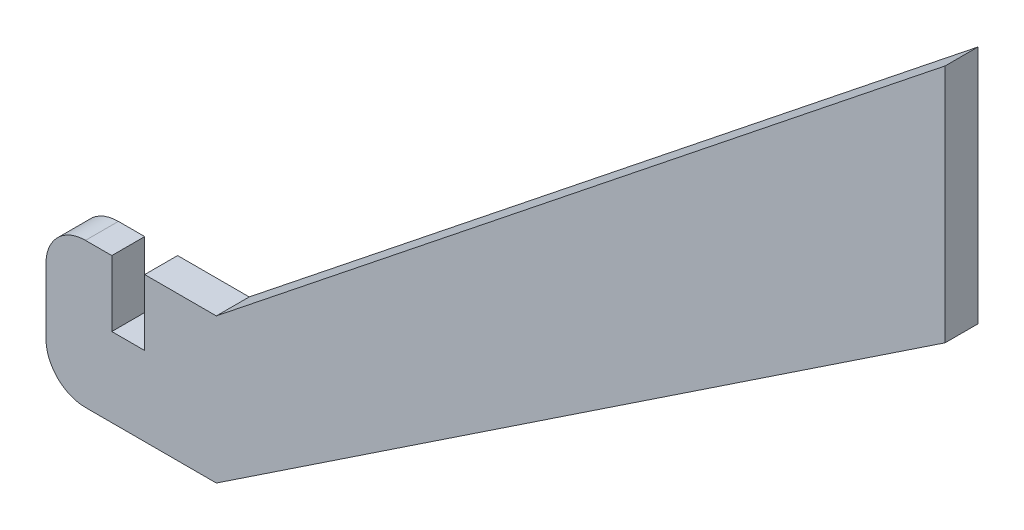
ISO-10303-21;
HEADER;
FILE_DESCRIPTION(('STEP AP214'),'2;1');
FILE_NAME('part.step','',(''),(''),'','','');
FILE_SCHEMA(('AUTOMOTIVE_DESIGN { 1 0 10303 214 1 1 1 1 }'));
ENDSEC;
DATA;
#1=APPLICATION_CONTEXT('core data for automotive mechanical design processes');
#2=APPLICATION_PROTOCOL_DEFINITION('international standard','automotive_design',2000,#1);
#3=PRODUCT_CONTEXT('',#1,'mechanical');
#4=PRODUCT('Part','Part','',(#3));
#5=PRODUCT_RELATED_PRODUCT_CATEGORY('part','',(#4));
#6=PRODUCT_DEFINITION_FORMATION('','',#4);
#7=PRODUCT_DEFINITION_CONTEXT('part definition',#1,'design');
#8=PRODUCT_DEFINITION('design','',#6,#7);
#9=PRODUCT_DEFINITION_SHAPE('','',#8);
#10=(LENGTH_UNIT() NAMED_UNIT(*) SI_UNIT(.MILLI.,.METRE.));
#11=(NAMED_UNIT(*) PLANE_ANGLE_UNIT() SI_UNIT($,.RADIAN.));
#12=(NAMED_UNIT(*) SI_UNIT($,.STERADIAN.) SOLID_ANGLE_UNIT());
#13=UNCERTAINTY_MEASURE_WITH_UNIT(LENGTH_MEASURE(1.E-05),#10,'distance_accuracy_value','');
#14=(GEOMETRIC_REPRESENTATION_CONTEXT(3) GLOBAL_UNCERTAINTY_ASSIGNED_CONTEXT((#13)) GLOBAL_UNIT_ASSIGNED_CONTEXT((#10,
#11,#12)) REPRESENTATION_CONTEXT('',''));
#15=CARTESIAN_POINT('',(0.,0.,0.));
#16=DIRECTION('',(0.,0.,1.));
#17=DIRECTION('',(1.,0.,0.));
#18=AXIS2_PLACEMENT_3D('',#15,#16,#17);
#19=CARTESIAN_POINT('',(1.29431293515836,0.,0.125));
#20=DIRECTION('',(0.,1.,0.));
#21=DIRECTION('',(-1.,0.,0.));
#22=AXIS2_PLACEMENT_3D('',#19,#20,#21);
#23=PLANE('',#22);
#24=DIRECTION('',(1.,0.,0.));
#25=VECTOR('',#24,1.);
#26=CARTESIAN_POINT('',(1.29431293515836,0.,0.125));
#27=LINE('',#26,#25);
#28=CARTESIAN_POINT('',(0.3,0.,0.125));
#29=VERTEX_POINT('',#28);
#30=CARTESIAN_POINT('',(1.29431293515836,0.,0.125));
#31=VERTEX_POINT('',#30);
#32=EDGE_CURVE('E129',#29,#31,#27,.T.);
#33=ORIENTED_EDGE('',*,*,#32,.F.);
#34=DIRECTION('',(0.,0.,-1.));
#35=VECTOR('',#34,1.);
#36=CARTESIAN_POINT('',(0.3,0.,0.125));
#37=LINE('',#36,#35);
#38=CARTESIAN_POINT('',(0.3,0.,-0.125));
#39=VERTEX_POINT('',#38);
#40=EDGE_CURVE('E11',#29,#39,#37,.T.);
#41=ORIENTED_EDGE('',*,*,#40,.T.);
#42=DIRECTION('',(1.,0.,0.));
#43=VECTOR('',#42,1.);
#44=CARTESIAN_POINT('',(1.29431293515836,0.,-0.125));
#45=LINE('',#44,#43);
#46=CARTESIAN_POINT('',(1.29431293515836,0.,-0.125));
#47=VERTEX_POINT('',#46);
#48=EDGE_CURVE('E151',#39,#47,#45,.T.);
#49=ORIENTED_EDGE('',*,*,#48,.T.);
#50=DIRECTION('',(0.,0.,-1.));
#51=VECTOR('',#50,1.);
#52=CARTESIAN_POINT('',(1.29431293515836,0.,0.125));
#53=LINE('',#52,#51);
#54=EDGE_CURVE('E143',#31,#47,#53,.T.);
#55=ORIENTED_EDGE('',*,*,#54,.F.);
#56=EDGE_LOOP('',(#33,#41,#49,#55));
#57=FACE_BOUND('',#56,.T.);
#58=ADVANCED_FACE('F39',(#57),#23,.F.);
#59=CARTESIAN_POINT('',(6.83221590449934,3.69176152899713,0.125));
#60=DIRECTION('',(-0.554682119391637,0.832062345276604,0.));
#61=DIRECTION('',(-0.832062345276604,-0.554682119391637,0.));
#62=AXIS2_PLACEMENT_3D('',#59,#60,#61);
#63=PLANE('',#62);
#64=DIRECTION('',(0.832062345276604,0.554682119391637,0.));
#65=VECTOR('',#64,1.);
#66=CARTESIAN_POINT('',(6.83221590449934,3.69176152899713,-0.125));
#67=LINE('',#66,#65);
#68=CARTESIAN_POINT('',(6.83221590449934,3.69176152899713,-0.125));
#69=VERTEX_POINT('',#68);
#70=EDGE_CURVE('E249',#47,#69,#67,.T.);
#71=ORIENTED_EDGE('',*,*,#70,.T.);
#72=DIRECTION('',(0.,0.,-1.));
#73=VECTOR('',#72,1.);
#74=CARTESIAN_POINT('',(6.83221590449934,3.69176152899713,0.125));
#75=LINE('',#74,#73);
#76=CARTESIAN_POINT('',(6.83221590449934,3.69176152899713,0.125));
#77=VERTEX_POINT('',#76);
#78=EDGE_CURVE('E145',#77,#69,#75,.T.);
#79=ORIENTED_EDGE('',*,*,#78,.F.);
#80=DIRECTION('',(0.832062345276604,0.554682119391637,0.));
#81=VECTOR('',#80,1.);
#82=CARTESIAN_POINT('',(6.83221590449934,3.69176152899713,0.125));
#83=LINE('',#82,#81);
#84=EDGE_CURVE('E132',#31,#77,#83,.T.);
#85=ORIENTED_EDGE('',*,*,#84,.F.);
#86=ORIENTED_EDGE('',*,*,#54,.T.);
#87=EDGE_LOOP('',(#71,#79,#85,#86));
#88=FACE_BOUND('',#87,.T.);
#89=ADVANCED_FACE('F142',(#88),#63,.F.);
#90=CARTESIAN_POINT('',(6.83221590449934,5.51399279259194,0.125));
#91=DIRECTION('',(-1.,0.,0.));
#92=DIRECTION('',(0.,0.,1.));
#93=AXIS2_PLACEMENT_3D('',#90,#91,#92);
#94=PLANE('',#93);
#95=DIRECTION('',(0.,1.,0.));
#96=VECTOR('',#95,1.);
#97=CARTESIAN_POINT('',(6.83221590449934,5.51399279259194,-0.125));
#98=LINE('',#97,#96);
#99=CARTESIAN_POINT('',(6.83221590449934,5.51399279259194,-0.125));
#100=VERTEX_POINT('',#99);
#101=EDGE_CURVE('E240',#69,#100,#98,.T.);
#102=ORIENTED_EDGE('',*,*,#101,.T.);
#103=DIRECTION('',(0.,0.,-1.));
#104=VECTOR('',#103,1.);
#105=CARTESIAN_POINT('',(6.83221590449934,5.51399279259194,0.125));
#106=LINE('',#105,#104);
#107=CARTESIAN_POINT('',(6.83221590449934,5.51399279259194,0.125));
#108=VERTEX_POINT('',#107);
#109=EDGE_CURVE('E160',#108,#100,#106,.T.);
#110=ORIENTED_EDGE('',*,*,#109,.F.);
#111=DIRECTION('',(0.,1.,0.));
#112=VECTOR('',#111,1.);
#113=CARTESIAN_POINT('',(6.83221590449934,5.51399279259194,0.125));
#114=LINE('',#113,#112);
#115=EDGE_CURVE('E148',#77,#108,#114,.T.);
#116=ORIENTED_EDGE('',*,*,#115,.F.);
#117=ORIENTED_EDGE('',*,*,#78,.T.);
#118=EDGE_LOOP('',(#102,#110,#116,#117));
#119=FACE_BOUND('',#118,.T.);
#120=ADVANCED_FACE('F277',(#119),#94,.F.);
#121=CARTESIAN_POINT('',(1.29431293515836,1.1,0.125));
#122=DIRECTION('',(0.623288024914606,-0.781992351623754,0.));
#123=DIRECTION('',(0.781992351623754,0.623288024914606,0.));
#124=AXIS2_PLACEMENT_3D('',#121,#122,#123);
#125=PLANE('',#124);
#126=DIRECTION('',(-0.781992351623754,-0.623288024914606,0.));
#127=VECTOR('',#126,1.);
#128=CARTESIAN_POINT('',(1.29431293515836,1.1,-0.125));
#129=LINE('',#128,#127);
#130=CARTESIAN_POINT('',(1.29431293515836,1.1,-0.125));
#131=VERTEX_POINT('',#130);
#132=EDGE_CURVE('E235',#100,#131,#129,.T.);
#133=ORIENTED_EDGE('',*,*,#132,.T.);
#134=DIRECTION('',(0.,0.,-1.));
#135=VECTOR('',#134,1.);
#136=CARTESIAN_POINT('',(1.29431293515836,1.1,0.125));
#137=LINE('',#136,#135);
#138=CARTESIAN_POINT('',(1.29431293515836,1.1,0.125));
#139=VERTEX_POINT('',#138);
#140=EDGE_CURVE('E224',#139,#131,#137,.T.);
#141=ORIENTED_EDGE('',*,*,#140,.F.);
#142=DIRECTION('',(-0.781992351623754,-0.623288024914606,0.));
#143=VECTOR('',#142,1.);
#144=CARTESIAN_POINT('',(1.29431293515836,1.1,0.125));
#145=LINE('',#144,#143);
#146=EDGE_CURVE('E236',#108,#139,#145,.T.);
#147=ORIENTED_EDGE('',*,*,#146,.F.);
#148=ORIENTED_EDGE('',*,*,#109,.T.);
#149=EDGE_LOOP('',(#133,#141,#147,#148));
#150=FACE_BOUND('',#149,.T.);
#151=ADVANCED_FACE('F233',(#150),#125,.F.);
#152=CARTESIAN_POINT('',(0.75,1.1,0.125));
#153=DIRECTION('',(0.,-1.,0.));
#154=DIRECTION('',(0.,0.,-1.));
#155=AXIS2_PLACEMENT_3D('',#152,#153,#154);
#156=PLANE('',#155);
#157=DIRECTION('',(-1.,0.,0.));
#158=VECTOR('',#157,1.);
#159=CARTESIAN_POINT('',(0.75,1.1,-0.125));
#160=LINE('',#159,#158);
#161=CARTESIAN_POINT('',(0.75,1.1,-0.125));
#162=VERTEX_POINT('',#161);
#163=EDGE_CURVE('E242',#131,#162,#160,.T.);
#164=ORIENTED_EDGE('',*,*,#163,.T.);
#165=DIRECTION('',(0.,0.,-1.));
#166=VECTOR('',#165,1.);
#167=CARTESIAN_POINT('',(0.75,1.1,0.125));
#168=LINE('',#167,#166);
#169=CARTESIAN_POINT('',(0.75,1.1,0.125));
#170=VERTEX_POINT('',#169);
#171=EDGE_CURVE('E220',#170,#162,#168,.T.);
#172=ORIENTED_EDGE('',*,*,#171,.F.);
#173=DIRECTION('',(-1.,0.,0.));
#174=VECTOR('',#173,1.);
#175=CARTESIAN_POINT('',(0.75,1.1,0.125));
#176=LINE('',#175,#174);
#177=EDGE_CURVE('E281',#139,#170,#176,.T.);
#178=ORIENTED_EDGE('',*,*,#177,.F.);
#179=ORIENTED_EDGE('',*,*,#140,.T.);
#180=EDGE_LOOP('',(#164,#172,#178,#179));
#181=FACE_BOUND('',#180,.T.);
#182=ADVANCED_FACE('F292',(#181),#156,.F.);
#183=CARTESIAN_POINT('',(0.75,0.6,0.125));
#184=DIRECTION('',(1.,0.,0.));
#185=DIRECTION('',(0.,0.,-1.));
#186=AXIS2_PLACEMENT_3D('',#183,#184,#185);
#187=PLANE('',#186);
#188=DIRECTION('',(0.,-1.,0.));
#189=VECTOR('',#188,1.);
#190=CARTESIAN_POINT('',(0.75,0.6,-0.125));
#191=LINE('',#190,#189);
#192=CARTESIAN_POINT('',(0.75,0.6,-0.125));
#193=VERTEX_POINT('',#192);
#194=EDGE_CURVE('E247',#162,#193,#191,.T.);
#195=ORIENTED_EDGE('',*,*,#194,.T.);
#196=DIRECTION('',(0.,0.,-1.));
#197=VECTOR('',#196,1.);
#198=CARTESIAN_POINT('',(0.75,0.6,0.125));
#199=LINE('',#198,#197);
#200=CARTESIAN_POINT('',(0.75,0.6,0.125));
#201=VERTEX_POINT('',#200);
#202=EDGE_CURVE('E216',#201,#193,#199,.T.);
#203=ORIENTED_EDGE('',*,*,#202,.F.);
#204=DIRECTION('',(0.,-1.,0.));
#205=VECTOR('',#204,1.);
#206=CARTESIAN_POINT('',(0.75,0.6,0.125));
#207=LINE('',#206,#205);
#208=EDGE_CURVE('E271',#170,#201,#207,.T.);
#209=ORIENTED_EDGE('',*,*,#208,.F.);
#210=ORIENTED_EDGE('',*,*,#171,.T.);
#211=EDGE_LOOP('',(#195,#203,#209,#210));
#212=FACE_BOUND('',#211,.T.);
#213=ADVANCED_FACE('F290',(#212),#187,.F.);
#214=CARTESIAN_POINT('',(0.5,0.6,0.125));
#215=DIRECTION('',(0.,-1.,0.));
#216=DIRECTION('',(0.,0.,-1.));
#217=AXIS2_PLACEMENT_3D('',#214,#215,#216);
#218=PLANE('',#217);
#219=DIRECTION('',(-1.,0.,0.));
#220=VECTOR('',#219,1.);
#221=CARTESIAN_POINT('',(0.5,0.6,-0.125));
#222=LINE('',#221,#220);
#223=CARTESIAN_POINT('',(0.5,0.6,-0.125));
#224=VERTEX_POINT('',#223);
#225=EDGE_CURVE('E206',#193,#224,#222,.T.);
#226=ORIENTED_EDGE('',*,*,#225,.T.);
#227=DIRECTION('',(0.,0.,-1.));
#228=VECTOR('',#227,1.);
#229=CARTESIAN_POINT('',(0.5,0.6,0.125));
#230=LINE('',#229,#228);
#231=CARTESIAN_POINT('',(0.5,0.6,0.125));
#232=VERTEX_POINT('',#231);
#233=EDGE_CURVE('E212',#232,#224,#230,.T.);
#234=ORIENTED_EDGE('',*,*,#233,.F.);
#235=DIRECTION('',(-1.,0.,0.));
#236=VECTOR('',#235,1.);
#237=CARTESIAN_POINT('',(0.5,0.6,0.125));
#238=LINE('',#237,#236);
#239=EDGE_CURVE('E266',#201,#232,#238,.T.);
#240=ORIENTED_EDGE('',*,*,#239,.F.);
#241=ORIENTED_EDGE('',*,*,#202,.T.);
#242=EDGE_LOOP('',(#226,#234,#240,#241));
#243=FACE_BOUND('',#242,.T.);
#244=ADVANCED_FACE('F258',(#243),#218,.F.);
#245=CARTESIAN_POINT('',(0.5,1.1,0.125));
#246=DIRECTION('',(-1.,0.,0.));
#247=DIRECTION('',(0.,-1.,0.));
#248=AXIS2_PLACEMENT_3D('',#245,#246,#247);
#249=PLANE('',#248);
#250=DIRECTION('',(0.,1.,0.));
#251=VECTOR('',#250,1.);
#252=CARTESIAN_POINT('',(0.5,1.1,-0.125));
#253=LINE('',#252,#251);
#254=CARTESIAN_POINT('',(0.5,1.1,-0.125));
#255=VERTEX_POINT('',#254);
#256=EDGE_CURVE('E201',#224,#255,#253,.T.);
#257=ORIENTED_EDGE('',*,*,#256,.T.);
#258=DIRECTION('',(0.,0.,-1.));
#259=VECTOR('',#258,1.);
#260=CARTESIAN_POINT('',(0.5,1.1,0.125));
#261=LINE('',#260,#259);
#262=CARTESIAN_POINT('',(0.5,1.1,0.125));
#263=VERTEX_POINT('',#262);
#264=EDGE_CURVE('E189',#263,#255,#261,.T.);
#265=ORIENTED_EDGE('',*,*,#264,.F.);
#266=DIRECTION('',(0.,1.,0.));
#267=VECTOR('',#266,1.);
#268=CARTESIAN_POINT('',(0.5,1.1,0.125));
#269=LINE('',#268,#267);
#270=EDGE_CURVE('E264',#232,#263,#269,.T.);
#271=ORIENTED_EDGE('',*,*,#270,.F.);
#272=ORIENTED_EDGE('',*,*,#233,.T.);
#273=EDGE_LOOP('',(#257,#265,#271,#272));
#274=FACE_BOUND('',#273,.T.);
#275=ADVANCED_FACE('F263',(#274),#249,.F.);
#276=CARTESIAN_POINT('',(0.,1.1,0.125));
#277=DIRECTION('',(0.,-1.,0.));
#278=DIRECTION('',(0.,0.,-1.));
#279=AXIS2_PLACEMENT_3D('',#276,#277,#278);
#280=PLANE('',#279);
#281=DIRECTION('',(-1.,0.,0.));
#282=VECTOR('',#281,1.);
#283=CARTESIAN_POINT('',(0.,1.1,-0.125));
#284=LINE('',#283,#282);
#285=CARTESIAN_POINT('',(0.3,1.1,-0.125));
#286=VERTEX_POINT('',#285);
#287=EDGE_CURVE('E196',#255,#286,#284,.T.);
#288=ORIENTED_EDGE('',*,*,#287,.T.);
#289=DIRECTION('',(0.,0.,-1.));
#290=VECTOR('',#289,1.);
#291=CARTESIAN_POINT('',(0.3,1.1,0.125));
#292=LINE('',#291,#290);
#293=CARTESIAN_POINT('',(0.3,1.1,0.125));
#294=VERTEX_POINT('',#293);
#295=EDGE_CURVE('E63',#286,#294,#292,.F.);
#296=ORIENTED_EDGE('',*,*,#295,.T.);
#297=DIRECTION('',(-1.,0.,0.));
#298=VECTOR('',#297,1.);
#299=CARTESIAN_POINT('',(0.,1.1,0.125));
#300=LINE('',#299,#298);
#301=EDGE_CURVE('E180',#263,#294,#300,.T.);
#302=ORIENTED_EDGE('',*,*,#301,.F.);
#303=ORIENTED_EDGE('',*,*,#264,.T.);
#304=EDGE_LOOP('',(#288,#296,#302,#303));
#305=FACE_BOUND('',#304,.T.);
#306=ADVANCED_FACE('F198',(#305),#280,.F.);
#307=CARTESIAN_POINT('',(0.,0.,0.125));
#308=DIRECTION('',(1.,0.,0.));
#309=DIRECTION('',(0.,0.,-1.));
#310=AXIS2_PLACEMENT_3D('',#307,#308,#309);
#311=PLANE('',#310);
#312=DIRECTION('',(0.,-1.,0.));
#313=VECTOR('',#312,1.);
#314=CARTESIAN_POINT('',(0.,0.,0.125));
#315=LINE('',#314,#313);
#316=CARTESIAN_POINT('',(0.,0.8,0.125));
#317=VERTEX_POINT('',#316);
#318=CARTESIAN_POINT('',(0.,0.3,0.125));
#319=VERTEX_POINT('',#318);
#320=EDGE_CURVE('E179',#317,#319,#315,.T.);
#321=ORIENTED_EDGE('',*,*,#320,.F.);
#322=DIRECTION('',(0.,0.,-1.));
#323=VECTOR('',#322,1.);
#324=CARTESIAN_POINT('',(0.,0.8,0.125));
#325=LINE('',#324,#323);
#326=CARTESIAN_POINT('',(0.,0.8,-0.125));
#327=VERTEX_POINT('',#326);
#328=EDGE_CURVE('E158',#317,#327,#325,.T.);
#329=ORIENTED_EDGE('',*,*,#328,.T.);
#330=DIRECTION('',(0.,-1.,0.));
#331=VECTOR('',#330,1.);
#332=CARTESIAN_POINT('',(0.,0.,-0.125));
#333=LINE('',#332,#331);
#334=CARTESIAN_POINT('',(0.,0.3,-0.125));
#335=VERTEX_POINT('',#334);
#336=EDGE_CURVE('E138',#327,#335,#333,.T.);
#337=ORIENTED_EDGE('',*,*,#336,.T.);
#338=DIRECTION('',(0.,0.,-1.));
#339=VECTOR('',#338,1.);
#340=CARTESIAN_POINT('',(0.,0.3,0.125));
#341=LINE('',#340,#339);
#342=EDGE_CURVE('E154',#335,#319,#341,.F.);
#343=ORIENTED_EDGE('',*,*,#342,.T.);
#344=EDGE_LOOP('',(#321,#329,#337,#343));
#345=FACE_BOUND('',#344,.T.);
#346=ADVANCED_FACE('F184',(#345),#311,.F.);
#347=CARTESIAN_POINT('',(0.,0.,0.125));
#348=DIRECTION('',(0.,0.,-1.));
#349=DIRECTION('',(-1.,0.,0.));
#350=AXIS2_PLACEMENT_3D('',#347,#348,#349);
#351=PLANE('',#350);
#352=ORIENTED_EDGE('',*,*,#301,.T.);
#353=CARTESIAN_POINT('',(0.3,0.8,0.125));
#354=DIRECTION('',(0.,0.,-1.));
#355=DIRECTION('',(-1.,0.,0.));
#356=AXIS2_PLACEMENT_3D('',#353,#354,#355);
#357=CIRCLE('',#356,0.3);
#358=EDGE_CURVE('E48',#294,#317,#357,.F.);
#359=ORIENTED_EDGE('',*,*,#358,.T.);
#360=ORIENTED_EDGE('',*,*,#320,.T.);
#361=CARTESIAN_POINT('',(0.3,0.3,0.125));
#362=DIRECTION('',(0.,0.,-1.));
#363=DIRECTION('',(-1.,0.,0.));
#364=AXIS2_PLACEMENT_3D('',#361,#362,#363);
#365=CIRCLE('',#364,0.3);
#366=EDGE_CURVE('E55',#319,#29,#365,.F.);
#367=ORIENTED_EDGE('',*,*,#366,.T.);
#368=ORIENTED_EDGE('',*,*,#32,.T.);
#369=ORIENTED_EDGE('',*,*,#84,.T.);
#370=ORIENTED_EDGE('',*,*,#115,.T.);
#371=ORIENTED_EDGE('',*,*,#146,.T.);
#372=ORIENTED_EDGE('',*,*,#177,.T.);
#373=ORIENTED_EDGE('',*,*,#208,.T.);
#374=ORIENTED_EDGE('',*,*,#239,.T.);
#375=ORIENTED_EDGE('',*,*,#270,.T.);
#376=EDGE_LOOP('',(#352,#359,#360,#367,#368,#369,#370,#371,#372,#373,#374,#375));
#377=FACE_BOUND('',#376,.T.);
#378=ADVANCED_FACE('F131',(#377),#351,.F.);
#379=CARTESIAN_POINT('',(0.,0.,-0.125));
#380=DIRECTION('',(0.,0.,-1.));
#381=DIRECTION('',(-1.,0.,0.));
#382=AXIS2_PLACEMENT_3D('',#379,#380,#381);
#383=PLANE('',#382);
#384=ORIENTED_EDGE('',*,*,#336,.F.);
#385=CARTESIAN_POINT('',(0.3,0.8,-0.125));
#386=DIRECTION('',(0.,0.,-1.));
#387=DIRECTION('',(-1.,0.,0.));
#388=AXIS2_PLACEMENT_3D('',#385,#386,#387);
#389=CIRCLE('',#388,0.3);
#390=EDGE_CURVE('E170',#327,#286,#389,.T.);
#391=ORIENTED_EDGE('',*,*,#390,.T.);
#392=ORIENTED_EDGE('',*,*,#287,.F.);
#393=ORIENTED_EDGE('',*,*,#256,.F.);
#394=ORIENTED_EDGE('',*,*,#225,.F.);
#395=ORIENTED_EDGE('',*,*,#194,.F.);
#396=ORIENTED_EDGE('',*,*,#163,.F.);
#397=ORIENTED_EDGE('',*,*,#132,.F.);
#398=ORIENTED_EDGE('',*,*,#101,.F.);
#399=ORIENTED_EDGE('',*,*,#70,.F.);
#400=ORIENTED_EDGE('',*,*,#48,.F.);
#401=CARTESIAN_POINT('',(0.3,0.3,-0.125));
#402=DIRECTION('',(0.,0.,-1.));
#403=DIRECTION('',(-1.,0.,0.));
#404=AXIS2_PLACEMENT_3D('',#401,#402,#403);
#405=CIRCLE('',#404,0.3);
#406=EDGE_CURVE('E167',#39,#335,#405,.T.);
#407=ORIENTED_EDGE('',*,*,#406,.T.);
#408=EDGE_LOOP('',(#384,#391,#392,#393,#394,#395,#396,#397,#398,#399,#400,#407));
#409=FACE_BOUND('',#408,.T.);
#410=ADVANCED_FACE('F194',(#409),#383,.T.);
#411=CARTESIAN_POINT('',(0.3,0.8,0.125));
#412=DIRECTION('',(0.,0.,-1.));
#413=DIRECTION('',(-1.,0.,0.));
#414=AXIS2_PLACEMENT_3D('',#411,#412,#413);
#415=CYLINDRICAL_SURFACE('',#414,0.3);
#416=ORIENTED_EDGE('',*,*,#358,.F.);
#417=ORIENTED_EDGE('',*,*,#295,.F.);
#418=ORIENTED_EDGE('',*,*,#390,.F.);
#419=ORIENTED_EDGE('',*,*,#328,.F.);
#420=EDGE_LOOP('',(#416,#417,#418,#419));
#421=FACE_BOUND('',#420,.T.);
#422=ADVANCED_FACE('F191',(#421),#415,.T.);
#423=CARTESIAN_POINT('',(0.3,0.3,0.125));
#424=DIRECTION('',(0.,0.,-1.));
#425=DIRECTION('',(-1.,0.,0.));
#426=AXIS2_PLACEMENT_3D('',#423,#424,#425);
#427=CYLINDRICAL_SURFACE('',#426,0.3);
#428=ORIENTED_EDGE('',*,*,#366,.F.);
#429=ORIENTED_EDGE('',*,*,#342,.F.);
#430=ORIENTED_EDGE('',*,*,#406,.F.);
#431=ORIENTED_EDGE('',*,*,#40,.F.);
#432=EDGE_LOOP('',(#428,#429,#430,#431));
#433=FACE_BOUND('',#432,.T.);
#434=ADVANCED_FACE('F41',(#433),#427,.T.);
#435=CLOSED_SHELL('',(#58,#89,#120,#151,#182,#213,#244,#275,#306,#346,#378,#410,#422,#434));
#436=MANIFOLD_SOLID_BREP('B2',#435);
#437=ADVANCED_BREP_SHAPE_REPRESENTATION('',(#18,#436),#14);
#438=SHAPE_DEFINITION_REPRESENTATION(#9,#437);
ENDSEC;
END-ISO-10303-21;
